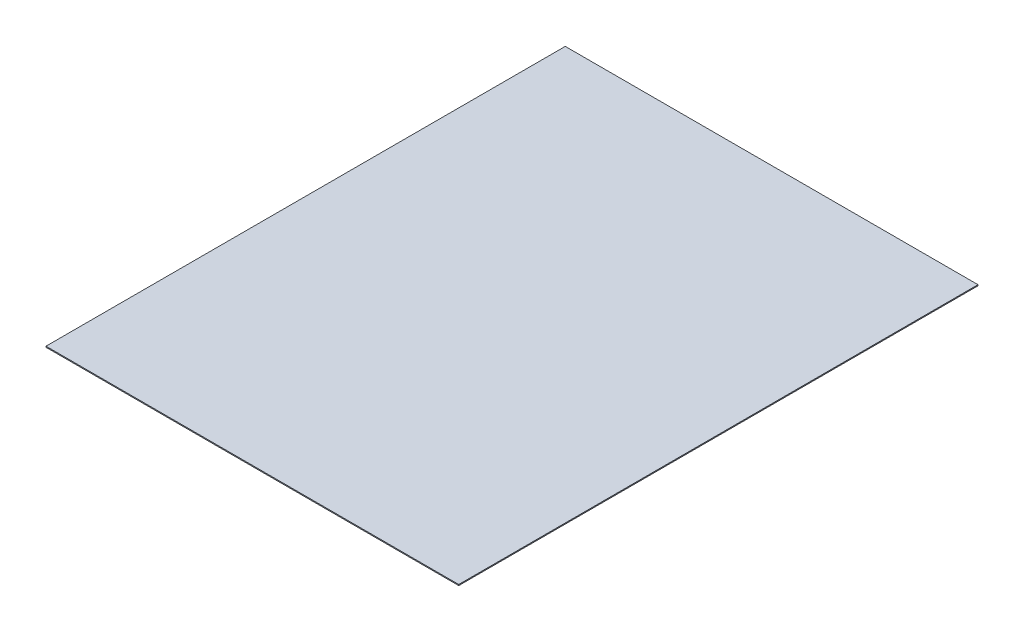
ISO-10303-21;
HEADER;
FILE_DESCRIPTION(('STEP AP214'),'2;1');
FILE_NAME('part.step','',(''),(''),'','','');
FILE_SCHEMA(('AUTOMOTIVE_DESIGN { 1 0 10303 214 1 1 1 1 }'));
ENDSEC;
DATA;
#1=APPLICATION_CONTEXT('core data for automotive mechanical design processes');
#2=APPLICATION_PROTOCOL_DEFINITION('international standard','automotive_design',2000,#1);
#3=PRODUCT_CONTEXT('',#1,'mechanical');
#4=PRODUCT('Part','Part','',(#3));
#5=PRODUCT_RELATED_PRODUCT_CATEGORY('part','',(#4));
#6=PRODUCT_DEFINITION_FORMATION('','',#4);
#7=PRODUCT_DEFINITION_CONTEXT('part definition',#1,'design');
#8=PRODUCT_DEFINITION('design','',#6,#7);
#9=PRODUCT_DEFINITION_SHAPE('','',#8);
#10=(LENGTH_UNIT() NAMED_UNIT(*) SI_UNIT(.MILLI.,.METRE.));
#11=(NAMED_UNIT(*) PLANE_ANGLE_UNIT() SI_UNIT($,.RADIAN.));
#12=(NAMED_UNIT(*) SI_UNIT($,.STERADIAN.) SOLID_ANGLE_UNIT());
#13=UNCERTAINTY_MEASURE_WITH_UNIT(LENGTH_MEASURE(1.E-05),#10,'distance_accuracy_value','');
#14=(GEOMETRIC_REPRESENTATION_CONTEXT(3) GLOBAL_UNCERTAINTY_ASSIGNED_CONTEXT((#13)) GLOBAL_UNIT_ASSIGNED_CONTEXT((#10,
#11,#12)) REPRESENTATION_CONTEXT('',''));
#15=CARTESIAN_POINT('',(0.,0.,0.));
#16=DIRECTION('',(0.,0.,1.));
#17=DIRECTION('',(1.,0.,0.));
#18=AXIS2_PLACEMENT_3D('',#15,#16,#17);
#19=CARTESIAN_POINT('',(40.,1072.,-800.));
#20=DIRECTION('',(-1.,0.,0.));
#21=DIRECTION('',(0.,0.,1.));
#22=AXIS2_PLACEMENT_3D('',#19,#20,#21);
#23=PLANE('',#22);
#24=DIRECTION('',(0.,-1.,0.));
#25=VECTOR('',#24,1.);
#26=CARTESIAN_POINT('',(40.,1072.,-20.));
#27=LINE('',#26,#25);
#28=CARTESIAN_POINT('',(40.,1073.5,-20.));
#29=VERTEX_POINT('',#28);
#30=CARTESIAN_POINT('',(40.,1072.,-20.));
#31=VERTEX_POINT('',#30);
#32=EDGE_CURVE('E103',#29,#31,#27,.T.);
#33=ORIENTED_EDGE('',*,*,#32,.F.);
#34=DIRECTION('',(0.,0.,1.));
#35=VECTOR('',#34,1.);
#36=CARTESIAN_POINT('',(40.,1073.5,-800.));
#37=LINE('',#36,#35);
#38=CARTESIAN_POINT('',(40.,1073.5,-800.));
#39=VERTEX_POINT('',#38);
#40=EDGE_CURVE('E11',#39,#29,#37,.T.);
#41=ORIENTED_EDGE('',*,*,#40,.F.);
#42=DIRECTION('',(0.,-1.,0.));
#43=VECTOR('',#42,1.);
#44=CARTESIAN_POINT('',(40.,1072.,-800.));
#45=LINE('',#44,#43);
#46=CARTESIAN_POINT('',(40.,1072.,-800.));
#47=VERTEX_POINT('',#46);
#48=EDGE_CURVE('E97',#39,#47,#45,.T.);
#49=ORIENTED_EDGE('',*,*,#48,.T.);
#50=DIRECTION('',(0.,0.,1.));
#51=VECTOR('',#50,1.);
#52=CARTESIAN_POINT('',(40.,1072.,-800.));
#53=LINE('',#52,#51);
#54=EDGE_CURVE('E42',#47,#31,#53,.T.);
#55=ORIENTED_EDGE('',*,*,#54,.T.);
#56=EDGE_LOOP('',(#33,#41,#49,#55));
#57=FACE_BOUND('',#56,.T.);
#58=ADVANCED_FACE('F39',(#57),#23,.T.);
#59=CARTESIAN_POINT('',(40.,1073.5,-800.));
#60=DIRECTION('',(0.,1.,0.));
#61=DIRECTION('',(0.,0.,1.));
#62=AXIS2_PLACEMENT_3D('',#59,#60,#61);
#63=PLANE('',#62);
#64=DIRECTION('',(-1.,0.,0.));
#65=VECTOR('',#64,1.);
#66=CARTESIAN_POINT('',(40.,1073.5,-20.));
#67=LINE('',#66,#65);
#68=CARTESIAN_POINT('',(660.,1073.5,-20.));
#69=VERTEX_POINT('',#68);
#70=EDGE_CURVE('E99',#69,#29,#67,.T.);
#71=ORIENTED_EDGE('',*,*,#70,.F.);
#72=DIRECTION('',(0.,0.,1.));
#73=VECTOR('',#72,1.);
#74=CARTESIAN_POINT('',(660.,1073.5,-800.));
#75=LINE('',#74,#73);
#76=CARTESIAN_POINT('',(660.,1073.5,-800.));
#77=VERTEX_POINT('',#76);
#78=EDGE_CURVE('E48',#77,#69,#75,.T.);
#79=ORIENTED_EDGE('',*,*,#78,.F.);
#80=DIRECTION('',(-1.,0.,0.));
#81=VECTOR('',#80,1.);
#82=CARTESIAN_POINT('',(40.,1073.5,-800.));
#83=LINE('',#82,#81);
#84=EDGE_CURVE('E94',#77,#39,#83,.T.);
#85=ORIENTED_EDGE('',*,*,#84,.T.);
#86=ORIENTED_EDGE('',*,*,#40,.T.);
#87=EDGE_LOOP('',(#71,#79,#85,#86));
#88=FACE_BOUND('',#87,.T.);
#89=ADVANCED_FACE('F113',(#88),#63,.T.);
#90=CARTESIAN_POINT('',(660.,1072.,-800.));
#91=DIRECTION('',(1.,0.,0.));
#92=DIRECTION('',(0.,0.,-1.));
#93=AXIS2_PLACEMENT_3D('',#90,#91,#92);
#94=PLANE('',#93);
#95=DIRECTION('',(0.,1.,0.));
#96=VECTOR('',#95,1.);
#97=CARTESIAN_POINT('',(660.,1072.,-20.));
#98=LINE('',#97,#96);
#99=CARTESIAN_POINT('',(660.,1072.,-20.));
#100=VERTEX_POINT('',#99);
#101=EDGE_CURVE('E89',#100,#69,#98,.T.);
#102=ORIENTED_EDGE('',*,*,#101,.F.);
#103=DIRECTION('',(0.,0.,1.));
#104=VECTOR('',#103,1.);
#105=CARTESIAN_POINT('',(660.,1072.,-800.));
#106=LINE('',#105,#104);
#107=CARTESIAN_POINT('',(660.,1072.,-800.));
#108=VERTEX_POINT('',#107);
#109=EDGE_CURVE('E84',#108,#100,#106,.T.);
#110=ORIENTED_EDGE('',*,*,#109,.F.);
#111=DIRECTION('',(0.,1.,0.));
#112=VECTOR('',#111,1.);
#113=CARTESIAN_POINT('',(660.,1072.,-800.));
#114=LINE('',#113,#112);
#115=EDGE_CURVE('E87',#108,#77,#114,.T.);
#116=ORIENTED_EDGE('',*,*,#115,.T.);
#117=ORIENTED_EDGE('',*,*,#78,.T.);
#118=EDGE_LOOP('',(#102,#110,#116,#117));
#119=FACE_BOUND('',#118,.T.);
#120=ADVANCED_FACE('F86',(#119),#94,.T.);
#121=CARTESIAN_POINT('',(40.,1072.,-800.));
#122=DIRECTION('',(0.,-1.,0.));
#123=DIRECTION('',(0.,0.,-1.));
#124=AXIS2_PLACEMENT_3D('',#121,#122,#123);
#125=PLANE('',#124);
#126=DIRECTION('',(1.,0.,0.));
#127=VECTOR('',#126,1.);
#128=CARTESIAN_POINT('',(40.,1072.,-20.));
#129=LINE('',#128,#127);
#130=EDGE_CURVE('E106',#31,#100,#129,.T.);
#131=ORIENTED_EDGE('',*,*,#130,.F.);
#132=ORIENTED_EDGE('',*,*,#54,.F.);
#133=DIRECTION('',(1.,0.,0.));
#134=VECTOR('',#133,1.);
#135=CARTESIAN_POINT('',(40.,1072.,-800.));
#136=LINE('',#135,#134);
#137=EDGE_CURVE('E93',#47,#108,#136,.T.);
#138=ORIENTED_EDGE('',*,*,#137,.T.);
#139=ORIENTED_EDGE('',*,*,#109,.T.);
#140=EDGE_LOOP('',(#131,#132,#138,#139));
#141=FACE_BOUND('',#140,.T.);
#142=ADVANCED_FACE('F96',(#141),#125,.T.);
#143=CARTESIAN_POINT('',(0.,0.,-800.));
#144=DIRECTION('',(0.,0.,-1.));
#145=DIRECTION('',(-1.,0.,0.));
#146=AXIS2_PLACEMENT_3D('',#143,#144,#145);
#147=PLANE('',#146);
#148=ORIENTED_EDGE('',*,*,#48,.F.);
#149=ORIENTED_EDGE('',*,*,#84,.F.);
#150=ORIENTED_EDGE('',*,*,#115,.F.);
#151=ORIENTED_EDGE('',*,*,#137,.F.);
#152=EDGE_LOOP('',(#148,#149,#150,#151));
#153=FACE_BOUND('',#152,.T.);
#154=ADVANCED_FACE('F92',(#153),#147,.T.);
#155=CARTESIAN_POINT('',(0.,0.,-20.));
#156=DIRECTION('',(0.,0.,-1.));
#157=DIRECTION('',(-1.,0.,0.));
#158=AXIS2_PLACEMENT_3D('',#155,#156,#157);
#159=PLANE('',#158);
#160=ORIENTED_EDGE('',*,*,#32,.T.);
#161=ORIENTED_EDGE('',*,*,#130,.T.);
#162=ORIENTED_EDGE('',*,*,#101,.T.);
#163=ORIENTED_EDGE('',*,*,#70,.T.);
#164=EDGE_LOOP('',(#160,#161,#162,#163));
#165=FACE_BOUND('',#164,.T.);
#166=ADVANCED_FACE('F112',(#165),#159,.F.);
#167=CLOSED_SHELL('',(#58,#89,#120,#142,#154,#166));
#168=MANIFOLD_SOLID_BREP('B2',#167);
#169=ADVANCED_BREP_SHAPE_REPRESENTATION('',(#18,#168),#14);
#170=SHAPE_DEFINITION_REPRESENTATION(#9,#169);
ENDSEC;
END-ISO-10303-21;
